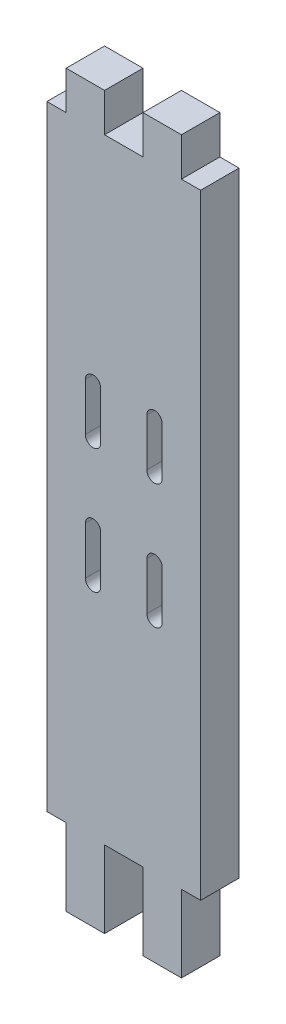
ISO-10303-21;
HEADER;
FILE_DESCRIPTION(('STEP AP214'),'2;1');
FILE_NAME('part.step','',(''),(''),'','','');
FILE_SCHEMA(('AUTOMOTIVE_DESIGN { 1 0 10303 214 1 1 1 1 }'));
ENDSEC;
DATA;
#1=APPLICATION_CONTEXT('core data for automotive mechanical design processes');
#2=APPLICATION_PROTOCOL_DEFINITION('international standard','automotive_design',2000,#1);
#3=PRODUCT_CONTEXT('',#1,'mechanical');
#4=PRODUCT('Part','Part','',(#3));
#5=PRODUCT_RELATED_PRODUCT_CATEGORY('part','',(#4));
#6=PRODUCT_DEFINITION_FORMATION('','',#4);
#7=PRODUCT_DEFINITION_CONTEXT('part definition',#1,'design');
#8=PRODUCT_DEFINITION('design','',#6,#7);
#9=PRODUCT_DEFINITION_SHAPE('','',#8);
#10=(LENGTH_UNIT() NAMED_UNIT(*) SI_UNIT(.MILLI.,.METRE.));
#11=(NAMED_UNIT(*) PLANE_ANGLE_UNIT() SI_UNIT($,.RADIAN.));
#12=(NAMED_UNIT(*) SI_UNIT($,.STERADIAN.) SOLID_ANGLE_UNIT());
#13=UNCERTAINTY_MEASURE_WITH_UNIT(LENGTH_MEASURE(1.E-05),#10,'distance_accuracy_value','');
#14=(GEOMETRIC_REPRESENTATION_CONTEXT(3) GLOBAL_UNCERTAINTY_ASSIGNED_CONTEXT((#13)) GLOBAL_UNIT_ASSIGNED_CONTEXT((#10,
#11,#12)) REPRESENTATION_CONTEXT('',''));
#15=CARTESIAN_POINT('',(0.,0.,0.));
#16=DIRECTION('',(0.,0.,1.));
#17=DIRECTION('',(1.,0.,0.));
#18=AXIS2_PLACEMENT_3D('',#15,#16,#17);
#19=CARTESIAN_POINT('',(0.,0.,5.));
#20=DIRECTION('',(0.,0.,1.));
#21=DIRECTION('',(1.,0.,0.));
#22=AXIS2_PLACEMENT_3D('',#19,#20,#21);
#23=PLANE('',#22);
#24=DIRECTION('',(-1.,0.,0.));
#25=VECTOR('',#24,1.);
#26=CARTESIAN_POINT('',(7.5,40.,5.));
#27=LINE('',#26,#25);
#28=CARTESIAN_POINT('',(10.,40.,5.));
#29=VERTEX_POINT('',#28);
#30=CARTESIAN_POINT('',(7.5,40.,5.));
#31=VERTEX_POINT('',#30);
#32=EDGE_CURVE('E422',#29,#31,#27,.T.);
#33=ORIENTED_EDGE('',*,*,#32,.T.);
#34=DIRECTION('',(0.,1.,0.));
#35=VECTOR('',#34,1.);
#36=CARTESIAN_POINT('',(7.5,45.,5.));
#37=LINE('',#36,#35);
#38=CARTESIAN_POINT('',(7.5,45.,5.));
#39=VERTEX_POINT('',#38);
#40=EDGE_CURVE('E426',#31,#39,#37,.T.);
#41=ORIENTED_EDGE('',*,*,#40,.T.);
#42=DIRECTION('',(-1.,0.,0.));
#43=VECTOR('',#42,1.);
#44=CARTESIAN_POINT('',(2.5,45.,5.));
#45=LINE('',#44,#43);
#46=CARTESIAN_POINT('',(2.5,45.,5.));
#47=VERTEX_POINT('',#46);
#48=EDGE_CURVE('E436',#39,#47,#45,.T.);
#49=ORIENTED_EDGE('',*,*,#48,.T.);
#50=DIRECTION('',(0.,-1.,0.));
#51=VECTOR('',#50,1.);
#52=CARTESIAN_POINT('',(2.5,40.,5.));
#53=LINE('',#52,#51);
#54=CARTESIAN_POINT('',(2.5,40.,5.));
#55=VERTEX_POINT('',#54);
#56=EDGE_CURVE('E438',#47,#55,#53,.T.);
#57=ORIENTED_EDGE('',*,*,#56,.T.);
#58=DIRECTION('',(-1.,0.,0.));
#59=VECTOR('',#58,1.);
#60=CARTESIAN_POINT('',(-2.5,40.,5.));
#61=LINE('',#60,#59);
#62=CARTESIAN_POINT('',(-2.5,40.,5.));
#63=VERTEX_POINT('',#62);
#64=EDGE_CURVE('E441',#55,#63,#61,.T.);
#65=ORIENTED_EDGE('',*,*,#64,.T.);
#66=DIRECTION('',(0.,1.,0.));
#67=VECTOR('',#66,1.);
#68=CARTESIAN_POINT('',(-2.5,45.,5.));
#69=LINE('',#68,#67);
#70=CARTESIAN_POINT('',(-2.5,45.,5.));
#71=VERTEX_POINT('',#70);
#72=EDGE_CURVE('E444',#63,#71,#69,.T.);
#73=ORIENTED_EDGE('',*,*,#72,.T.);
#74=DIRECTION('',(-1.,0.,0.));
#75=VECTOR('',#74,1.);
#76=CARTESIAN_POINT('',(-7.5,45.,5.));
#77=LINE('',#76,#75);
#78=CARTESIAN_POINT('',(-7.5,45.,5.));
#79=VERTEX_POINT('',#78);
#80=EDGE_CURVE('E452',#71,#79,#77,.T.);
#81=ORIENTED_EDGE('',*,*,#80,.T.);
#82=DIRECTION('',(0.,-1.,0.));
#83=VECTOR('',#82,1.);
#84=CARTESIAN_POINT('',(-7.5,40.,5.));
#85=LINE('',#84,#83);
#86=CARTESIAN_POINT('',(-7.5,40.,5.));
#87=VERTEX_POINT('',#86);
#88=EDGE_CURVE('E454',#79,#87,#85,.T.);
#89=ORIENTED_EDGE('',*,*,#88,.T.);
#90=DIRECTION('',(-1.,0.,0.));
#91=VECTOR('',#90,1.);
#92=CARTESIAN_POINT('',(-10.,40.,5.));
#93=LINE('',#92,#91);
#94=CARTESIAN_POINT('',(-10.,40.,5.));
#95=VERTEX_POINT('',#94);
#96=EDGE_CURVE('E457',#87,#95,#93,.T.);
#97=ORIENTED_EDGE('',*,*,#96,.T.);
#98=DIRECTION('',(0.,-1.,0.));
#99=VECTOR('',#98,1.);
#100=CARTESIAN_POINT('',(-10.,-40.,5.));
#101=LINE('',#100,#99);
#102=CARTESIAN_POINT('',(-10.,-40.,5.));
#103=VERTEX_POINT('',#102);
#104=EDGE_CURVE('E460',#95,#103,#101,.T.);
#105=ORIENTED_EDGE('',*,*,#104,.T.);
#106=DIRECTION('',(1.,0.,0.));
#107=VECTOR('',#106,1.);
#108=CARTESIAN_POINT('',(-10.,-40.,5.));
#109=LINE('',#108,#107);
#110=CARTESIAN_POINT('',(-7.5,-40.,5.));
#111=VERTEX_POINT('',#110);
#112=EDGE_CURVE('E468',#103,#111,#109,.T.);
#113=ORIENTED_EDGE('',*,*,#112,.T.);
#114=DIRECTION('',(0.,-1.,0.));
#115=VECTOR('',#114,1.);
#116=CARTESIAN_POINT('',(-7.5,-40.,5.));
#117=LINE('',#116,#115);
#118=CARTESIAN_POINT('',(-7.5,-50.,5.));
#119=VERTEX_POINT('',#118);
#120=EDGE_CURVE('E470',#111,#119,#117,.T.);
#121=ORIENTED_EDGE('',*,*,#120,.T.);
#122=DIRECTION('',(1.,0.,0.));
#123=VECTOR('',#122,1.);
#124=CARTESIAN_POINT('',(-7.5,-50.,5.));
#125=LINE('',#124,#123);
#126=CARTESIAN_POINT('',(-2.5,-50.,5.));
#127=VERTEX_POINT('',#126);
#128=EDGE_CURVE('E473',#119,#127,#125,.T.);
#129=ORIENTED_EDGE('',*,*,#128,.T.);
#130=DIRECTION('',(0.,1.,0.));
#131=VECTOR('',#130,1.);
#132=CARTESIAN_POINT('',(-2.5,-50.,5.));
#133=LINE('',#132,#131);
#134=CARTESIAN_POINT('',(-2.5,-40.,5.));
#135=VERTEX_POINT('',#134);
#136=EDGE_CURVE('E476',#127,#135,#133,.T.);
#137=ORIENTED_EDGE('',*,*,#136,.T.);
#138=DIRECTION('',(1.,0.,0.));
#139=VECTOR('',#138,1.);
#140=CARTESIAN_POINT('',(-2.5,-40.,5.));
#141=LINE('',#140,#139);
#142=CARTESIAN_POINT('',(2.5,-40.,5.));
#143=VERTEX_POINT('',#142);
#144=EDGE_CURVE('E484',#135,#143,#141,.T.);
#145=ORIENTED_EDGE('',*,*,#144,.T.);
#146=DIRECTION('',(0.,-1.,0.));
#147=VECTOR('',#146,1.);
#148=CARTESIAN_POINT('',(2.5,-40.,5.));
#149=LINE('',#148,#147);
#150=CARTESIAN_POINT('',(2.5,-50.,5.));
#151=VERTEX_POINT('',#150);
#152=EDGE_CURVE('E486',#143,#151,#149,.T.);
#153=ORIENTED_EDGE('',*,*,#152,.T.);
#154=DIRECTION('',(1.,0.,0.));
#155=VECTOR('',#154,1.);
#156=CARTESIAN_POINT('',(2.5,-50.,5.));
#157=LINE('',#156,#155);
#158=CARTESIAN_POINT('',(7.5,-50.,5.));
#159=VERTEX_POINT('',#158);
#160=EDGE_CURVE('E489',#151,#159,#157,.T.);
#161=ORIENTED_EDGE('',*,*,#160,.T.);
#162=DIRECTION('',(0.,1.,0.));
#163=VECTOR('',#162,1.);
#164=CARTESIAN_POINT('',(7.5,-50.,5.));
#165=LINE('',#164,#163);
#166=CARTESIAN_POINT('',(7.5,-40.,5.));
#167=VERTEX_POINT('',#166);
#168=EDGE_CURVE('E492',#159,#167,#165,.T.);
#169=ORIENTED_EDGE('',*,*,#168,.T.);
#170=DIRECTION('',(1.,0.,0.));
#171=VECTOR('',#170,1.);
#172=CARTESIAN_POINT('',(7.5,-40.,5.));
#173=LINE('',#172,#171);
#174=CARTESIAN_POINT('',(10.,-40.,5.));
#175=VERTEX_POINT('',#174);
#176=EDGE_CURVE('E498',#167,#175,#173,.T.);
#177=ORIENTED_EDGE('',*,*,#176,.T.);
#178=DIRECTION('',(0.,1.,0.));
#179=VECTOR('',#178,1.);
#180=CARTESIAN_POINT('',(10.,-40.,5.));
#181=LINE('',#180,#179);
#182=EDGE_CURVE('E500',#175,#29,#181,.T.);
#183=ORIENTED_EDGE('',*,*,#182,.T.);
#184=EDGE_LOOP('',(#33,#41,#49,#57,#65,#73,#81,#89,#97,#105,#113,#121,#129,#137,#145,#153,#161,
#169,#177,#183));
#185=FACE_BOUND('',#184,.T.);
#186=DIRECTION('',(0.,1.,0.));
#187=VECTOR('',#186,1.);
#188=CARTESIAN_POINT('',(5.00000000000001,-11.2,5.));
#189=LINE('',#188,#187);
#190=CARTESIAN_POINT('',(5.00000000000001,-11.2,5.));
#191=VERTEX_POINT('',#190);
#192=CARTESIAN_POINT('',(5.,-4.99999999999999,5.));
#193=VERTEX_POINT('',#192);
#194=EDGE_CURVE('E387',#191,#193,#189,.T.);
#195=ORIENTED_EDGE('',*,*,#194,.F.);
#196=CARTESIAN_POINT('',(4.,-11.2,5.));
#197=DIRECTION('',(0.,0.,1.));
#198=DIRECTION('',(1.,0.,0.));
#199=AXIS2_PLACEMENT_3D('',#196,#197,#198);
#200=CIRCLE('',#199,1.);
#201=CARTESIAN_POINT('',(3.,-11.2,5.));
#202=VERTEX_POINT('',#201);
#203=EDGE_CURVE('E384',#202,#191,#200,.T.);
#204=ORIENTED_EDGE('',*,*,#203,.F.);
#205=DIRECTION('',(0.,-1.,0.));
#206=VECTOR('',#205,1.);
#207=CARTESIAN_POINT('',(3.,-11.2,5.));
#208=LINE('',#207,#206);
#209=CARTESIAN_POINT('',(3.,-4.99999999999999,5.));
#210=VERTEX_POINT('',#209);
#211=EDGE_CURVE('E396',#210,#202,#208,.T.);
#212=ORIENTED_EDGE('',*,*,#211,.F.);
#213=CARTESIAN_POINT('',(4.,-4.99999999999999,5.));
#214=DIRECTION('',(0.,0.,1.));
#215=DIRECTION('',(1.,0.,0.));
#216=AXIS2_PLACEMENT_3D('',#213,#214,#215);
#217=CIRCLE('',#216,1.);
#218=EDGE_CURVE('E400',#193,#210,#217,.T.);
#219=ORIENTED_EDGE('',*,*,#218,.F.);
#220=EDGE_LOOP('',(#195,#204,#212,#219));
#221=FACE_BOUND('',#220,.T.);
#222=DIRECTION('',(0.,-1.,0.));
#223=VECTOR('',#222,1.);
#224=CARTESIAN_POINT('',(3.,11.2,5.));
#225=LINE('',#224,#223);
#226=CARTESIAN_POINT('',(3.,11.2,5.));
#227=VERTEX_POINT('',#226);
#228=CARTESIAN_POINT('',(3.,5.00000000000001,5.));
#229=VERTEX_POINT('',#228);
#230=EDGE_CURVE('E349',#227,#229,#225,.T.);
#231=ORIENTED_EDGE('',*,*,#230,.F.);
#232=CARTESIAN_POINT('',(4.,11.2,5.));
#233=DIRECTION('',(0.,0.,1.));
#234=DIRECTION('',(-1.,0.,0.));
#235=AXIS2_PLACEMENT_3D('',#232,#233,#234);
#236=CIRCLE('',#235,1.);
#237=CARTESIAN_POINT('',(5.00000000000001,11.2,5.));
#238=VERTEX_POINT('',#237);
#239=EDGE_CURVE('E346',#238,#227,#236,.T.);
#240=ORIENTED_EDGE('',*,*,#239,.F.);
#241=DIRECTION('',(0.,1.,0.));
#242=VECTOR('',#241,1.);
#243=CARTESIAN_POINT('',(5.00000000000001,11.2,5.));
#244=LINE('',#243,#242);
#245=CARTESIAN_POINT('',(5.,5.00000000000001,5.));
#246=VERTEX_POINT('',#245);
#247=EDGE_CURVE('E358',#246,#238,#244,.T.);
#248=ORIENTED_EDGE('',*,*,#247,.F.);
#249=CARTESIAN_POINT('',(4.,5.00000000000001,5.));
#250=DIRECTION('',(0.,0.,1.));
#251=DIRECTION('',(-1.,0.,0.));
#252=AXIS2_PLACEMENT_3D('',#249,#250,#251);
#253=CIRCLE('',#252,1.);
#254=EDGE_CURVE('E362',#229,#246,#253,.T.);
#255=ORIENTED_EDGE('',*,*,#254,.F.);
#256=EDGE_LOOP('',(#231,#240,#248,#255));
#257=FACE_BOUND('',#256,.T.);
#258=DIRECTION('',(0.,-1.,0.));
#259=VECTOR('',#258,1.);
#260=CARTESIAN_POINT('',(-5.00000000000001,11.2,5.));
#261=LINE('',#260,#259);
#262=CARTESIAN_POINT('',(-5.00000000000001,11.2,5.));
#263=VERTEX_POINT('',#262);
#264=CARTESIAN_POINT('',(-5.,5.,5.));
#265=VERTEX_POINT('',#264);
#266=EDGE_CURVE('E313',#263,#265,#261,.T.);
#267=ORIENTED_EDGE('',*,*,#266,.F.);
#268=CARTESIAN_POINT('',(-4.00000000000001,11.2,5.));
#269=DIRECTION('',(0.,0.,1.));
#270=DIRECTION('',(1.,0.,0.));
#271=AXIS2_PLACEMENT_3D('',#268,#269,#270);
#272=CIRCLE('',#271,1.);
#273=CARTESIAN_POINT('',(-3.00000000000001,11.2,5.));
#274=VERTEX_POINT('',#273);
#275=EDGE_CURVE('E310',#274,#263,#272,.T.);
#276=ORIENTED_EDGE('',*,*,#275,.F.);
#277=DIRECTION('',(0.,1.,0.));
#278=VECTOR('',#277,1.);
#279=CARTESIAN_POINT('',(-3.00000000000001,11.2,5.));
#280=LINE('',#279,#278);
#281=CARTESIAN_POINT('',(-3.,5.,5.));
#282=VERTEX_POINT('',#281);
#283=EDGE_CURVE('E320',#282,#274,#280,.T.);
#284=ORIENTED_EDGE('',*,*,#283,.F.);
#285=CARTESIAN_POINT('',(-4.,5.,5.));
#286=DIRECTION('',(0.,0.,1.));
#287=DIRECTION('',(1.,0.,0.));
#288=AXIS2_PLACEMENT_3D('',#285,#286,#287);
#289=CIRCLE('',#288,1.);
#290=EDGE_CURVE('E324',#265,#282,#289,.T.);
#291=ORIENTED_EDGE('',*,*,#290,.F.);
#292=EDGE_LOOP('',(#267,#276,#284,#291));
#293=FACE_BOUND('',#292,.T.);
#294=DIRECTION('',(0.,1.,0.));
#295=VECTOR('',#294,1.);
#296=CARTESIAN_POINT('',(-3.00000000000001,-11.2,5.));
#297=LINE('',#296,#295);
#298=CARTESIAN_POINT('',(-3.00000000000001,-11.2,5.));
#299=VERTEX_POINT('',#298);
#300=CARTESIAN_POINT('',(-3.,-4.99999999999999,5.));
#301=VERTEX_POINT('',#300);
#302=EDGE_CURVE('E274',#299,#301,#297,.T.);
#303=ORIENTED_EDGE('',*,*,#302,.F.);
#304=CARTESIAN_POINT('',(-4.00000000000001,-11.2,5.));
#305=DIRECTION('',(0.,0.,1.));
#306=DIRECTION('',(-1.,0.,0.));
#307=AXIS2_PLACEMENT_3D('',#304,#305,#306);
#308=CIRCLE('',#307,1.);
#309=CARTESIAN_POINT('',(-5.00000000000001,-11.2,5.));
#310=VERTEX_POINT('',#309);
#311=EDGE_CURVE('E266',#310,#299,#308,.T.);
#312=ORIENTED_EDGE('',*,*,#311,.F.);
#313=DIRECTION('',(0.,-1.,0.));
#314=VECTOR('',#313,1.);
#315=CARTESIAN_POINT('',(-5.00000000000001,-11.2,5.));
#316=LINE('',#315,#314);
#317=CARTESIAN_POINT('',(-5.,-4.99999999999999,5.));
#318=VERTEX_POINT('',#317);
#319=EDGE_CURVE('E288',#318,#310,#316,.T.);
#320=ORIENTED_EDGE('',*,*,#319,.F.);
#321=CARTESIAN_POINT('',(-4.,-4.99999999999999,5.));
#322=DIRECTION('',(0.,0.,1.));
#323=DIRECTION('',(-1.,0.,0.));
#324=AXIS2_PLACEMENT_3D('',#321,#322,#323);
#325=CIRCLE('',#324,1.);
#326=EDGE_CURVE('E286',#301,#318,#325,.T.);
#327=ORIENTED_EDGE('',*,*,#326,.F.);
#328=EDGE_LOOP('',(#303,#312,#320,#327));
#329=FACE_BOUND('',#328,.T.);
#330=ADVANCED_FACE('F33',(#185,#221,#257,#293,#329),#23,.T.);
#331=CARTESIAN_POINT('',(0.,0.,0.));
#332=DIRECTION('',(0.,0.,1.));
#333=DIRECTION('',(1.,0.,0.));
#334=AXIS2_PLACEMENT_3D('',#331,#332,#333);
#335=PLANE('',#334);
#336=CARTESIAN_POINT('',(-4.00000000000001,11.2,0.));
#337=DIRECTION('',(0.,0.,1.));
#338=DIRECTION('',(1.,0.,0.));
#339=AXIS2_PLACEMENT_3D('',#336,#337,#338);
#340=CIRCLE('',#339,1.);
#341=CARTESIAN_POINT('',(-3.00000000000001,11.2,0.));
#342=VERTEX_POINT('',#341);
#343=CARTESIAN_POINT('',(-5.00000000000001,11.2,0.));
#344=VERTEX_POINT('',#343);
#345=EDGE_CURVE('E282',#342,#344,#340,.T.);
#346=ORIENTED_EDGE('',*,*,#345,.T.);
#347=DIRECTION('',(0.,-1.,0.));
#348=VECTOR('',#347,1.);
#349=CARTESIAN_POINT('',(-5.00000000000001,11.2,0.));
#350=LINE('',#349,#348);
#351=CARTESIAN_POINT('',(-5.,5.,0.));
#352=VERTEX_POINT('',#351);
#353=EDGE_CURVE('E328',#344,#352,#350,.T.);
#354=ORIENTED_EDGE('',*,*,#353,.T.);
#355=CARTESIAN_POINT('',(-4.,5.,0.));
#356=DIRECTION('',(0.,0.,1.));
#357=DIRECTION('',(1.,0.,0.));
#358=AXIS2_PLACEMENT_3D('',#355,#356,#357);
#359=CIRCLE('',#358,1.);
#360=CARTESIAN_POINT('',(-3.,5.,0.));
#361=VERTEX_POINT('',#360);
#362=EDGE_CURVE('E331',#352,#361,#359,.T.);
#363=ORIENTED_EDGE('',*,*,#362,.T.);
#364=DIRECTION('',(0.,1.,0.));
#365=VECTOR('',#364,1.);
#366=CARTESIAN_POINT('',(-3.00000000000001,11.2,0.));
#367=LINE('',#366,#365);
#368=EDGE_CURVE('E314',#361,#342,#367,.T.);
#369=ORIENTED_EDGE('',*,*,#368,.T.);
#370=EDGE_LOOP('',(#346,#354,#363,#369));
#371=FACE_BOUND('',#370,.T.);
#372=CARTESIAN_POINT('',(4.,-11.2,0.));
#373=DIRECTION('',(0.,0.,1.));
#374=DIRECTION('',(1.,0.,0.));
#375=AXIS2_PLACEMENT_3D('',#372,#373,#374);
#376=CIRCLE('',#375,1.);
#377=CARTESIAN_POINT('',(3.,-11.2,0.));
#378=VERTEX_POINT('',#377);
#379=CARTESIAN_POINT('',(5.00000000000001,-11.2,0.));
#380=VERTEX_POINT('',#379);
#381=EDGE_CURVE('E383',#378,#380,#376,.T.);
#382=ORIENTED_EDGE('',*,*,#381,.T.);
#383=DIRECTION('',(0.,1.,0.));
#384=VECTOR('',#383,1.);
#385=CARTESIAN_POINT('',(5.00000000000001,-11.2,0.));
#386=LINE('',#385,#384);
#387=CARTESIAN_POINT('',(5.,-4.99999999999999,0.));
#388=VERTEX_POINT('',#387);
#389=EDGE_CURVE('E404',#380,#388,#386,.T.);
#390=ORIENTED_EDGE('',*,*,#389,.T.);
#391=CARTESIAN_POINT('',(4.,-4.99999999999999,0.));
#392=DIRECTION('',(0.,0.,1.));
#393=DIRECTION('',(1.,0.,0.));
#394=AXIS2_PLACEMENT_3D('',#391,#392,#393);
#395=CIRCLE('',#394,1.);
#396=CARTESIAN_POINT('',(3.,-4.99999999999999,0.));
#397=VERTEX_POINT('',#396);
#398=EDGE_CURVE('E407',#388,#397,#395,.T.);
#399=ORIENTED_EDGE('',*,*,#398,.T.);
#400=DIRECTION('',(0.,-1.,0.));
#401=VECTOR('',#400,1.);
#402=CARTESIAN_POINT('',(3.,-11.2,0.));
#403=LINE('',#402,#401);
#404=EDGE_CURVE('E388',#397,#378,#403,.T.);
#405=ORIENTED_EDGE('',*,*,#404,.T.);
#406=EDGE_LOOP('',(#382,#390,#399,#405));
#407=FACE_BOUND('',#406,.T.);
#408=DIRECTION('',(-1.,0.,0.));
#409=VECTOR('',#408,1.);
#410=CARTESIAN_POINT('',(7.5,40.,0.));
#411=LINE('',#410,#409);
#412=CARTESIAN_POINT('',(10.,40.,0.));
#413=VERTEX_POINT('',#412);
#414=CARTESIAN_POINT('',(7.5,40.,0.));
#415=VERTEX_POINT('',#414);
#416=EDGE_CURVE('E421',#413,#415,#411,.T.);
#417=ORIENTED_EDGE('',*,*,#416,.F.);
#418=DIRECTION('',(0.,1.,0.));
#419=VECTOR('',#418,1.);
#420=CARTESIAN_POINT('',(10.,-40.,0.));
#421=LINE('',#420,#419);
#422=CARTESIAN_POINT('',(10.,-40.,0.));
#423=VERTEX_POINT('',#422);
#424=EDGE_CURVE('E427',#423,#413,#421,.T.);
#425=ORIENTED_EDGE('',*,*,#424,.F.);
#426=DIRECTION('',(1.,0.,0.));
#427=VECTOR('',#426,1.);
#428=CARTESIAN_POINT('',(7.5,-40.,0.));
#429=LINE('',#428,#427);
#430=CARTESIAN_POINT('',(7.5,-40.,0.));
#431=VERTEX_POINT('',#430);
#432=EDGE_CURVE('E542',#431,#423,#429,.T.);
#433=ORIENTED_EDGE('',*,*,#432,.F.);
#434=DIRECTION('',(0.,1.,0.));
#435=VECTOR('',#434,1.);
#436=CARTESIAN_POINT('',(7.5,-50.,0.));
#437=LINE('',#436,#435);
#438=CARTESIAN_POINT('',(7.5,-50.,0.));
#439=VERTEX_POINT('',#438);
#440=EDGE_CURVE('E540',#439,#431,#437,.T.);
#441=ORIENTED_EDGE('',*,*,#440,.F.);
#442=DIRECTION('',(1.,0.,0.));
#443=VECTOR('',#442,1.);
#444=CARTESIAN_POINT('',(2.5,-50.,0.));
#445=LINE('',#444,#443);
#446=CARTESIAN_POINT('',(2.5,-50.,0.));
#447=VERTEX_POINT('',#446);
#448=EDGE_CURVE('E538',#447,#439,#445,.T.);
#449=ORIENTED_EDGE('',*,*,#448,.F.);
#450=DIRECTION('',(0.,-1.,0.));
#451=VECTOR('',#450,1.);
#452=CARTESIAN_POINT('',(2.5,-45.,0.));
#453=LINE('',#452,#451);
#454=CARTESIAN_POINT('',(2.5,-40.,0.));
#455=VERTEX_POINT('',#454);
#456=EDGE_CURVE('E536',#455,#447,#453,.T.);
#457=ORIENTED_EDGE('',*,*,#456,.F.);
#458=DIRECTION('',(1.,0.,0.));
#459=VECTOR('',#458,1.);
#460=CARTESIAN_POINT('',(-2.5,-40.,0.));
#461=LINE('',#460,#459);
#462=CARTESIAN_POINT('',(-2.5,-40.,0.));
#463=VERTEX_POINT('',#462);
#464=EDGE_CURVE('E533',#463,#455,#461,.T.);
#465=ORIENTED_EDGE('',*,*,#464,.F.);
#466=DIRECTION('',(0.,1.,0.));
#467=VECTOR('',#466,1.);
#468=CARTESIAN_POINT('',(-2.5,-50.,0.));
#469=LINE('',#468,#467);
#470=CARTESIAN_POINT('',(-2.5,-50.,0.));
#471=VERTEX_POINT('',#470);
#472=EDGE_CURVE('E531',#471,#463,#469,.T.);
#473=ORIENTED_EDGE('',*,*,#472,.F.);
#474=DIRECTION('',(1.,0.,0.));
#475=VECTOR('',#474,1.);
#476=CARTESIAN_POINT('',(-7.5,-50.,0.));
#477=LINE('',#476,#475);
#478=CARTESIAN_POINT('',(-7.5,-50.,0.));
#479=VERTEX_POINT('',#478);
#480=EDGE_CURVE('E529',#479,#471,#477,.T.);
#481=ORIENTED_EDGE('',*,*,#480,.F.);
#482=DIRECTION('',(0.,-1.,0.));
#483=VECTOR('',#482,1.);
#484=CARTESIAN_POINT('',(-7.5,-45.,0.));
#485=LINE('',#484,#483);
#486=CARTESIAN_POINT('',(-7.5,-40.,0.));
#487=VERTEX_POINT('',#486);
#488=EDGE_CURVE('E527',#487,#479,#485,.T.);
#489=ORIENTED_EDGE('',*,*,#488,.F.);
#490=DIRECTION('',(1.,0.,0.));
#491=VECTOR('',#490,1.);
#492=CARTESIAN_POINT('',(-10.,-40.,0.));
#493=LINE('',#492,#491);
#494=CARTESIAN_POINT('',(-10.,-40.,0.));
#495=VERTEX_POINT('',#494);
#496=EDGE_CURVE('E524',#495,#487,#493,.T.);
#497=ORIENTED_EDGE('',*,*,#496,.F.);
#498=DIRECTION('',(0.,-1.,0.));
#499=VECTOR('',#498,1.);
#500=CARTESIAN_POINT('',(-10.,-40.,0.));
#501=LINE('',#500,#499);
#502=CARTESIAN_POINT('',(-10.,40.,0.));
#503=VERTEX_POINT('',#502);
#504=EDGE_CURVE('E522',#503,#495,#501,.T.);
#505=ORIENTED_EDGE('',*,*,#504,.F.);
#506=DIRECTION('',(-1.,0.,0.));
#507=VECTOR('',#506,1.);
#508=CARTESIAN_POINT('',(-10.,40.,0.));
#509=LINE('',#508,#507);
#510=CARTESIAN_POINT('',(-7.5,40.,0.));
#511=VERTEX_POINT('',#510);
#512=EDGE_CURVE('E520',#511,#503,#509,.T.);
#513=ORIENTED_EDGE('',*,*,#512,.F.);
#514=DIRECTION('',(0.,-1.,0.));
#515=VECTOR('',#514,1.);
#516=CARTESIAN_POINT('',(-7.5,40.,0.));
#517=LINE('',#516,#515);
#518=CARTESIAN_POINT('',(-7.5,45.,0.));
#519=VERTEX_POINT('',#518);
#520=EDGE_CURVE('E518',#519,#511,#517,.T.);
#521=ORIENTED_EDGE('',*,*,#520,.F.);
#522=DIRECTION('',(-1.,0.,0.));
#523=VECTOR('',#522,1.);
#524=CARTESIAN_POINT('',(-7.5,45.,0.));
#525=LINE('',#524,#523);
#526=CARTESIAN_POINT('',(-2.5,45.,0.));
#527=VERTEX_POINT('',#526);
#528=EDGE_CURVE('E516',#527,#519,#525,.T.);
#529=ORIENTED_EDGE('',*,*,#528,.F.);
#530=DIRECTION('',(0.,1.,0.));
#531=VECTOR('',#530,1.);
#532=CARTESIAN_POINT('',(-2.5,45.,0.));
#533=LINE('',#532,#531);
#534=CARTESIAN_POINT('',(-2.5,40.,0.));
#535=VERTEX_POINT('',#534);
#536=EDGE_CURVE('E514',#535,#527,#533,.T.);
#537=ORIENTED_EDGE('',*,*,#536,.F.);
#538=DIRECTION('',(-1.,0.,0.));
#539=VECTOR('',#538,1.);
#540=CARTESIAN_POINT('',(-2.5,40.,0.));
#541=LINE('',#540,#539);
#542=CARTESIAN_POINT('',(2.5,40.,0.));
#543=VERTEX_POINT('',#542);
#544=EDGE_CURVE('E512',#543,#535,#541,.T.);
#545=ORIENTED_EDGE('',*,*,#544,.F.);
#546=DIRECTION('',(0.,-1.,0.));
#547=VECTOR('',#546,1.);
#548=CARTESIAN_POINT('',(2.5,40.,0.));
#549=LINE('',#548,#547);
#550=CARTESIAN_POINT('',(2.5,45.,0.));
#551=VERTEX_POINT('',#550);
#552=EDGE_CURVE('E510',#551,#543,#549,.T.);
#553=ORIENTED_EDGE('',*,*,#552,.F.);
#554=DIRECTION('',(-1.,0.,0.));
#555=VECTOR('',#554,1.);
#556=CARTESIAN_POINT('',(2.5,45.,0.));
#557=LINE('',#556,#555);
#558=CARTESIAN_POINT('',(7.5,45.,0.));
#559=VERTEX_POINT('',#558);
#560=EDGE_CURVE('E508',#559,#551,#557,.T.);
#561=ORIENTED_EDGE('',*,*,#560,.F.);
#562=DIRECTION('',(0.,1.,0.));
#563=VECTOR('',#562,1.);
#564=CARTESIAN_POINT('',(7.5,45.,0.));
#565=LINE('',#564,#563);
#566=EDGE_CURVE('E506',#415,#559,#565,.T.);
#567=ORIENTED_EDGE('',*,*,#566,.F.);
#568=EDGE_LOOP('',(#417,#425,#433,#441,#449,#457,#465,#473,#481,#489,#497,#505,#513,#521,#529,
#537,#545,#553,#561,#567));
#569=FACE_BOUND('',#568,.T.);
#570=CARTESIAN_POINT('',(4.,11.2,0.));
#571=DIRECTION('',(0.,0.,1.));
#572=DIRECTION('',(-1.,0.,0.));
#573=AXIS2_PLACEMENT_3D('',#570,#571,#572);
#574=CIRCLE('',#573,1.);
#575=CARTESIAN_POINT('',(5.00000000000001,11.2,0.));
#576=VERTEX_POINT('',#575);
#577=CARTESIAN_POINT('',(3.,11.2,0.));
#578=VERTEX_POINT('',#577);
#579=EDGE_CURVE('E345',#576,#578,#574,.T.);
#580=ORIENTED_EDGE('',*,*,#579,.T.);
#581=DIRECTION('',(0.,-1.,0.));
#582=VECTOR('',#581,1.);
#583=CARTESIAN_POINT('',(3.,11.2,0.));
#584=LINE('',#583,#582);
#585=CARTESIAN_POINT('',(3.,5.00000000000001,0.));
#586=VERTEX_POINT('',#585);
#587=EDGE_CURVE('E366',#578,#586,#584,.T.);
#588=ORIENTED_EDGE('',*,*,#587,.T.);
#589=CARTESIAN_POINT('',(4.,5.00000000000001,0.));
#590=DIRECTION('',(0.,0.,1.));
#591=DIRECTION('',(-1.,0.,0.));
#592=AXIS2_PLACEMENT_3D('',#589,#590,#591);
#593=CIRCLE('',#592,1.);
#594=CARTESIAN_POINT('',(5.,5.00000000000001,0.));
#595=VERTEX_POINT('',#594);
#596=EDGE_CURVE('E369',#586,#595,#593,.T.);
#597=ORIENTED_EDGE('',*,*,#596,.T.);
#598=DIRECTION('',(0.,1.,0.));
#599=VECTOR('',#598,1.);
#600=CARTESIAN_POINT('',(5.00000000000001,11.2,0.));
#601=LINE('',#600,#599);
#602=EDGE_CURVE('E350',#595,#576,#601,.T.);
#603=ORIENTED_EDGE('',*,*,#602,.T.);
#604=EDGE_LOOP('',(#580,#588,#597,#603));
#605=FACE_BOUND('',#604,.T.);
#606=CARTESIAN_POINT('',(-4.00000000000001,-11.2,0.));
#607=DIRECTION('',(0.,0.,1.));
#608=DIRECTION('',(-1.,0.,0.));
#609=AXIS2_PLACEMENT_3D('',#606,#607,#608);
#610=CIRCLE('',#609,1.);
#611=CARTESIAN_POINT('',(-5.00000000000001,-11.2,0.));
#612=VERTEX_POINT('',#611);
#613=CARTESIAN_POINT('',(-3.00000000000001,-11.2,0.));
#614=VERTEX_POINT('',#613);
#615=EDGE_CURVE('E56',#612,#614,#610,.T.);
#616=ORIENTED_EDGE('',*,*,#615,.T.);
#617=DIRECTION('',(0.,1.,0.));
#618=VECTOR('',#617,1.);
#619=CARTESIAN_POINT('',(-3.00000000000001,-11.2,0.));
#620=LINE('',#619,#618);
#621=CARTESIAN_POINT('',(-3.,-4.99999999999999,0.));
#622=VERTEX_POINT('',#621);
#623=EDGE_CURVE('E281',#614,#622,#620,.T.);
#624=ORIENTED_EDGE('',*,*,#623,.T.);
#625=CARTESIAN_POINT('',(-4.,-4.99999999999999,0.));
#626=DIRECTION('',(0.,0.,1.));
#627=DIRECTION('',(-1.,0.,0.));
#628=AXIS2_PLACEMENT_3D('',#625,#626,#627);
#629=CIRCLE('',#628,1.);
#630=CARTESIAN_POINT('',(-5.,-4.99999999999999,0.));
#631=VERTEX_POINT('',#630);
#632=EDGE_CURVE('E302',#622,#631,#629,.T.);
#633=ORIENTED_EDGE('',*,*,#632,.T.);
#634=DIRECTION('',(0.,-1.,0.));
#635=VECTOR('',#634,1.);
#636=CARTESIAN_POINT('',(-5.00000000000001,-11.2,0.));
#637=LINE('',#636,#635);
#638=EDGE_CURVE('E275',#631,#612,#637,.T.);
#639=ORIENTED_EDGE('',*,*,#638,.T.);
#640=EDGE_LOOP('',(#616,#624,#633,#639));
#641=FACE_BOUND('',#640,.T.);
#642=ADVANCED_FACE('F608',(#371,#407,#569,#605,#641),#335,.F.);
#643=CARTESIAN_POINT('',(7.5,40.,5.));
#644=DIRECTION('',(0.,-1.,0.));
#645=DIRECTION('',(0.,0.,-1.));
#646=AXIS2_PLACEMENT_3D('',#643,#644,#645);
#647=PLANE('',#646);
#648=ORIENTED_EDGE('',*,*,#416,.T.);
#649=DIRECTION('',(0.,0.,-1.));
#650=VECTOR('',#649,1.);
#651=CARTESIAN_POINT('',(7.5,40.,5.));
#652=LINE('',#651,#650);
#653=EDGE_CURVE('E12',#31,#415,#652,.T.);
#654=ORIENTED_EDGE('',*,*,#653,.F.);
#655=ORIENTED_EDGE('',*,*,#32,.F.);
#656=DIRECTION('',(0.,0.,-1.));
#657=VECTOR('',#656,1.);
#658=CARTESIAN_POINT('',(10.,40.,5.));
#659=LINE('',#658,#657);
#660=EDGE_CURVE('E503',#29,#413,#659,.T.);
#661=ORIENTED_EDGE('',*,*,#660,.T.);
#662=EDGE_LOOP('',(#648,#654,#655,#661));
#663=FACE_BOUND('',#662,.T.);
#664=ADVANCED_FACE('F35',(#663),#647,.F.);
#665=CARTESIAN_POINT('',(7.5,45.,5.));
#666=DIRECTION('',(-1.,0.,0.));
#667=DIRECTION('',(0.,0.,1.));
#668=AXIS2_PLACEMENT_3D('',#665,#666,#667);
#669=PLANE('',#668);
#670=ORIENTED_EDGE('',*,*,#566,.T.);
#671=DIRECTION('',(0.,0.,-1.));
#672=VECTOR('',#671,1.);
#673=CARTESIAN_POINT('',(7.5,45.,5.));
#674=LINE('',#673,#672);
#675=EDGE_CURVE('E41',#39,#559,#674,.T.);
#676=ORIENTED_EDGE('',*,*,#675,.F.);
#677=ORIENTED_EDGE('',*,*,#40,.F.);
#678=ORIENTED_EDGE('',*,*,#653,.T.);
#679=EDGE_LOOP('',(#670,#676,#677,#678));
#680=FACE_BOUND('',#679,.T.);
#681=ADVANCED_FACE('F626',(#680),#669,.F.);
#682=CARTESIAN_POINT('',(2.5,45.,5.));
#683=DIRECTION('',(0.,-1.,0.));
#684=DIRECTION('',(1.,0.,0.));
#685=AXIS2_PLACEMENT_3D('',#682,#683,#684);
#686=PLANE('',#685);
#687=ORIENTED_EDGE('',*,*,#560,.T.);
#688=DIRECTION('',(0.,0.,-1.));
#689=VECTOR('',#688,1.);
#690=CARTESIAN_POINT('',(2.5,45.,5.));
#691=LINE('',#690,#689);
#692=EDGE_CURVE('E595',#47,#551,#691,.T.);
#693=ORIENTED_EDGE('',*,*,#692,.F.);
#694=ORIENTED_EDGE('',*,*,#48,.F.);
#695=ORIENTED_EDGE('',*,*,#675,.T.);
#696=EDGE_LOOP('',(#687,#693,#694,#695));
#697=FACE_BOUND('',#696,.T.);
#698=ADVANCED_FACE('F602',(#697),#686,.F.);
#699=CARTESIAN_POINT('',(2.5,40.,5.));
#700=DIRECTION('',(1.,0.,0.));
#701=DIRECTION('',(0.,0.,-1.));
#702=AXIS2_PLACEMENT_3D('',#699,#700,#701);
#703=PLANE('',#702);
#704=ORIENTED_EDGE('',*,*,#552,.T.);
#705=DIRECTION('',(0.,0.,-1.));
#706=VECTOR('',#705,1.);
#707=CARTESIAN_POINT('',(2.5,40.,5.));
#708=LINE('',#707,#706);
#709=EDGE_CURVE('E592',#55,#543,#708,.T.);
#710=ORIENTED_EDGE('',*,*,#709,.F.);
#711=ORIENTED_EDGE('',*,*,#56,.F.);
#712=ORIENTED_EDGE('',*,*,#692,.T.);
#713=EDGE_LOOP('',(#704,#710,#711,#712));
#714=FACE_BOUND('',#713,.T.);
#715=ADVANCED_FACE('F614',(#714),#703,.F.);
#716=CARTESIAN_POINT('',(-2.5,40.,5.));
#717=DIRECTION('',(0.,-1.,0.));
#718=DIRECTION('',(0.,0.,-1.));
#719=AXIS2_PLACEMENT_3D('',#716,#717,#718);
#720=PLANE('',#719);
#721=ORIENTED_EDGE('',*,*,#544,.T.);
#722=DIRECTION('',(0.,0.,-1.));
#723=VECTOR('',#722,1.);
#724=CARTESIAN_POINT('',(-2.5,40.,5.));
#725=LINE('',#724,#723);
#726=EDGE_CURVE('E589',#63,#535,#725,.T.);
#727=ORIENTED_EDGE('',*,*,#726,.F.);
#728=ORIENTED_EDGE('',*,*,#64,.F.);
#729=ORIENTED_EDGE('',*,*,#709,.T.);
#730=EDGE_LOOP('',(#721,#727,#728,#729));
#731=FACE_BOUND('',#730,.T.);
#732=ADVANCED_FACE('F618',(#731),#720,.F.);
#733=CARTESIAN_POINT('',(-2.5,45.,5.));
#734=DIRECTION('',(-1.,0.,0.));
#735=DIRECTION('',(0.,0.,1.));
#736=AXIS2_PLACEMENT_3D('',#733,#734,#735);
#737=PLANE('',#736);
#738=ORIENTED_EDGE('',*,*,#536,.T.);
#739=DIRECTION('',(0.,0.,-1.));
#740=VECTOR('',#739,1.);
#741=CARTESIAN_POINT('',(-2.5,45.,5.));
#742=LINE('',#741,#740);
#743=EDGE_CURVE('E586',#71,#527,#742,.T.);
#744=ORIENTED_EDGE('',*,*,#743,.F.);
#745=ORIENTED_EDGE('',*,*,#72,.F.);
#746=ORIENTED_EDGE('',*,*,#726,.T.);
#747=EDGE_LOOP('',(#738,#744,#745,#746));
#748=FACE_BOUND('',#747,.T.);
#749=ADVANCED_FACE('F697',(#748),#737,.F.);
#750=CARTESIAN_POINT('',(-7.5,45.,5.));
#751=DIRECTION('',(0.,-1.,0.));
#752=DIRECTION('',(0.,0.,-1.));
#753=AXIS2_PLACEMENT_3D('',#750,#751,#752);
#754=PLANE('',#753);
#755=ORIENTED_EDGE('',*,*,#528,.T.);
#756=DIRECTION('',(0.,0.,-1.));
#757=VECTOR('',#756,1.);
#758=CARTESIAN_POINT('',(-7.5,45.,5.));
#759=LINE('',#758,#757);
#760=EDGE_CURVE('E583',#79,#519,#759,.T.);
#761=ORIENTED_EDGE('',*,*,#760,.F.);
#762=ORIENTED_EDGE('',*,*,#80,.F.);
#763=ORIENTED_EDGE('',*,*,#743,.T.);
#764=EDGE_LOOP('',(#755,#761,#762,#763));
#765=FACE_BOUND('',#764,.T.);
#766=ADVANCED_FACE('F695',(#765),#754,.F.);
#767=CARTESIAN_POINT('',(-7.5,40.,5.));
#768=DIRECTION('',(1.,0.,0.));
#769=DIRECTION('',(0.,0.,-1.));
#770=AXIS2_PLACEMENT_3D('',#767,#768,#769);
#771=PLANE('',#770);
#772=ORIENTED_EDGE('',*,*,#520,.T.);
#773=DIRECTION('',(0.,0.,-1.));
#774=VECTOR('',#773,1.);
#775=CARTESIAN_POINT('',(-7.5,40.,5.));
#776=LINE('',#775,#774);
#777=EDGE_CURVE('E580',#87,#511,#776,.T.);
#778=ORIENTED_EDGE('',*,*,#777,.F.);
#779=ORIENTED_EDGE('',*,*,#88,.F.);
#780=ORIENTED_EDGE('',*,*,#760,.T.);
#781=EDGE_LOOP('',(#772,#778,#779,#780));
#782=FACE_BOUND('',#781,.T.);
#783=ADVANCED_FACE('F691',(#782),#771,.F.);
#784=CARTESIAN_POINT('',(-10.,40.,5.));
#785=DIRECTION('',(0.,-1.,0.));
#786=DIRECTION('',(0.,0.,-1.));
#787=AXIS2_PLACEMENT_3D('',#784,#785,#786);
#788=PLANE('',#787);
#789=ORIENTED_EDGE('',*,*,#512,.T.);
#790=DIRECTION('',(0.,0.,-1.));
#791=VECTOR('',#790,1.);
#792=CARTESIAN_POINT('',(-10.,40.,5.));
#793=LINE('',#792,#791);
#794=EDGE_CURVE('E577',#95,#503,#793,.T.);
#795=ORIENTED_EDGE('',*,*,#794,.F.);
#796=ORIENTED_EDGE('',*,*,#96,.F.);
#797=ORIENTED_EDGE('',*,*,#777,.T.);
#798=EDGE_LOOP('',(#789,#795,#796,#797));
#799=FACE_BOUND('',#798,.T.);
#800=ADVANCED_FACE('F686',(#799),#788,.F.);
#801=CARTESIAN_POINT('',(-10.,-40.,5.));
#802=DIRECTION('',(1.,0.,0.));
#803=DIRECTION('',(0.,0.,-1.));
#804=AXIS2_PLACEMENT_3D('',#801,#802,#803);
#805=PLANE('',#804);
#806=ORIENTED_EDGE('',*,*,#504,.T.);
#807=DIRECTION('',(0.,0.,-1.));
#808=VECTOR('',#807,1.);
#809=CARTESIAN_POINT('',(-10.,-40.,5.));
#810=LINE('',#809,#808);
#811=EDGE_CURVE('E574',#103,#495,#810,.T.);
#812=ORIENTED_EDGE('',*,*,#811,.F.);
#813=ORIENTED_EDGE('',*,*,#104,.F.);
#814=ORIENTED_EDGE('',*,*,#794,.T.);
#815=EDGE_LOOP('',(#806,#812,#813,#814));
#816=FACE_BOUND('',#815,.T.);
#817=ADVANCED_FACE('F680',(#816),#805,.F.);
#818=CARTESIAN_POINT('',(-10.,-40.,5.));
#819=DIRECTION('',(0.,1.,0.));
#820=DIRECTION('',(0.,0.,1.));
#821=AXIS2_PLACEMENT_3D('',#818,#819,#820);
#822=PLANE('',#821);
#823=ORIENTED_EDGE('',*,*,#496,.T.);
#824=DIRECTION('',(0.,0.,-1.));
#825=VECTOR('',#824,1.);
#826=CARTESIAN_POINT('',(-7.5,-40.,5.));
#827=LINE('',#826,#825);
#828=EDGE_CURVE('E571',#111,#487,#827,.T.);
#829=ORIENTED_EDGE('',*,*,#828,.F.);
#830=ORIENTED_EDGE('',*,*,#112,.F.);
#831=ORIENTED_EDGE('',*,*,#811,.T.);
#832=EDGE_LOOP('',(#823,#829,#830,#831));
#833=FACE_BOUND('',#832,.T.);
#834=ADVANCED_FACE('F675',(#833),#822,.F.);
#835=CARTESIAN_POINT('',(-7.5,-45.,5.));
#836=DIRECTION('',(1.,0.,0.));
#837=DIRECTION('',(0.,0.,-1.));
#838=AXIS2_PLACEMENT_3D('',#835,#836,#837);
#839=PLANE('',#838);
#840=ORIENTED_EDGE('',*,*,#488,.T.);
#841=DIRECTION('',(0.,0.,-1.));
#842=VECTOR('',#841,1.);
#843=CARTESIAN_POINT('',(-7.5,-50.,5.));
#844=LINE('',#843,#842);
#845=EDGE_CURVE('E568',#119,#479,#844,.T.);
#846=ORIENTED_EDGE('',*,*,#845,.F.);
#847=ORIENTED_EDGE('',*,*,#120,.F.);
#848=ORIENTED_EDGE('',*,*,#828,.T.);
#849=EDGE_LOOP('',(#840,#846,#847,#848));
#850=FACE_BOUND('',#849,.T.);
#851=ADVANCED_FACE('F670',(#850),#839,.F.);
#852=CARTESIAN_POINT('',(-7.5,-50.,5.));
#853=DIRECTION('',(0.,1.,0.));
#854=DIRECTION('',(0.,0.,1.));
#855=AXIS2_PLACEMENT_3D('',#852,#853,#854);
#856=PLANE('',#855);
#857=ORIENTED_EDGE('',*,*,#480,.T.);
#858=DIRECTION('',(0.,0.,-1.));
#859=VECTOR('',#858,1.);
#860=CARTESIAN_POINT('',(-2.5,-50.,5.));
#861=LINE('',#860,#859);
#862=EDGE_CURVE('E565',#127,#471,#861,.T.);
#863=ORIENTED_EDGE('',*,*,#862,.F.);
#864=ORIENTED_EDGE('',*,*,#128,.F.);
#865=ORIENTED_EDGE('',*,*,#845,.T.);
#866=EDGE_LOOP('',(#857,#863,#864,#865));
#867=FACE_BOUND('',#866,.T.);
#868=ADVANCED_FACE('F666',(#867),#856,.F.);
#869=CARTESIAN_POINT('',(-2.5,-50.,5.));
#870=DIRECTION('',(-1.,0.,0.));
#871=DIRECTION('',(0.,-1.,0.));
#872=AXIS2_PLACEMENT_3D('',#869,#870,#871);
#873=PLANE('',#872);
#874=ORIENTED_EDGE('',*,*,#472,.T.);
#875=DIRECTION('',(0.,0.,-1.));
#876=VECTOR('',#875,1.);
#877=CARTESIAN_POINT('',(-2.5,-40.,5.));
#878=LINE('',#877,#876);
#879=EDGE_CURVE('E562',#135,#463,#878,.T.);
#880=ORIENTED_EDGE('',*,*,#879,.F.);
#881=ORIENTED_EDGE('',*,*,#136,.F.);
#882=ORIENTED_EDGE('',*,*,#862,.T.);
#883=EDGE_LOOP('',(#874,#880,#881,#882));
#884=FACE_BOUND('',#883,.T.);
#885=ADVANCED_FACE('F661',(#884),#873,.F.);
#886=CARTESIAN_POINT('',(-2.5,-40.,5.));
#887=DIRECTION('',(0.,1.,0.));
#888=DIRECTION('',(0.,0.,1.));
#889=AXIS2_PLACEMENT_3D('',#886,#887,#888);
#890=PLANE('',#889);
#891=ORIENTED_EDGE('',*,*,#464,.T.);
#892=DIRECTION('',(0.,0.,-1.));
#893=VECTOR('',#892,1.);
#894=CARTESIAN_POINT('',(2.5,-40.,5.));
#895=LINE('',#894,#893);
#896=EDGE_CURVE('E559',#143,#455,#895,.T.);
#897=ORIENTED_EDGE('',*,*,#896,.F.);
#898=ORIENTED_EDGE('',*,*,#144,.F.);
#899=ORIENTED_EDGE('',*,*,#879,.T.);
#900=EDGE_LOOP('',(#891,#897,#898,#899));
#901=FACE_BOUND('',#900,.T.);
#902=ADVANCED_FACE('F656',(#901),#890,.F.);
#903=CARTESIAN_POINT('',(2.5,-45.,5.));
#904=DIRECTION('',(1.,0.,0.));
#905=DIRECTION('',(0.,1.,0.));
#906=AXIS2_PLACEMENT_3D('',#903,#904,#905);
#907=PLANE('',#906);
#908=ORIENTED_EDGE('',*,*,#456,.T.);
#909=DIRECTION('',(0.,0.,-1.));
#910=VECTOR('',#909,1.);
#911=CARTESIAN_POINT('',(2.5,-50.,5.));
#912=LINE('',#911,#910);
#913=EDGE_CURVE('E556',#151,#447,#912,.T.);
#914=ORIENTED_EDGE('',*,*,#913,.F.);
#915=ORIENTED_EDGE('',*,*,#152,.F.);
#916=ORIENTED_EDGE('',*,*,#896,.T.);
#917=EDGE_LOOP('',(#908,#914,#915,#916));
#918=FACE_BOUND('',#917,.T.);
#919=ADVANCED_FACE('F652',(#918),#907,.F.);
#920=CARTESIAN_POINT('',(2.5,-50.,5.));
#921=DIRECTION('',(0.,1.,0.));
#922=DIRECTION('',(0.,0.,1.));
#923=AXIS2_PLACEMENT_3D('',#920,#921,#922);
#924=PLANE('',#923);
#925=ORIENTED_EDGE('',*,*,#448,.T.);
#926=DIRECTION('',(0.,0.,-1.));
#927=VECTOR('',#926,1.);
#928=CARTESIAN_POINT('',(7.5,-50.,5.));
#929=LINE('',#928,#927);
#930=EDGE_CURVE('E553',#159,#439,#929,.T.);
#931=ORIENTED_EDGE('',*,*,#930,.F.);
#932=ORIENTED_EDGE('',*,*,#160,.F.);
#933=ORIENTED_EDGE('',*,*,#913,.T.);
#934=EDGE_LOOP('',(#925,#931,#932,#933));
#935=FACE_BOUND('',#934,.T.);
#936=ADVANCED_FACE('F647',(#935),#924,.F.);
#937=CARTESIAN_POINT('',(7.5,-50.,5.));
#938=DIRECTION('',(-1.,0.,0.));
#939=DIRECTION('',(0.,0.,1.));
#940=AXIS2_PLACEMENT_3D('',#937,#938,#939);
#941=PLANE('',#940);
#942=ORIENTED_EDGE('',*,*,#440,.T.);
#943=DIRECTION('',(0.,0.,-1.));
#944=VECTOR('',#943,1.);
#945=CARTESIAN_POINT('',(7.5,-40.,5.));
#946=LINE('',#945,#944);
#947=EDGE_CURVE('E550',#167,#431,#946,.T.);
#948=ORIENTED_EDGE('',*,*,#947,.F.);
#949=ORIENTED_EDGE('',*,*,#168,.F.);
#950=ORIENTED_EDGE('',*,*,#930,.T.);
#951=EDGE_LOOP('',(#942,#948,#949,#950));
#952=FACE_BOUND('',#951,.T.);
#953=ADVANCED_FACE('F642',(#952),#941,.F.);
#954=CARTESIAN_POINT('',(7.5,-40.,5.));
#955=DIRECTION('',(0.,1.,0.));
#956=DIRECTION('',(0.,0.,1.));
#957=AXIS2_PLACEMENT_3D('',#954,#955,#956);
#958=PLANE('',#957);
#959=ORIENTED_EDGE('',*,*,#432,.T.);
#960=DIRECTION('',(0.,0.,-1.));
#961=VECTOR('',#960,1.);
#962=CARTESIAN_POINT('',(10.,-40.,5.));
#963=LINE('',#962,#961);
#964=EDGE_CURVE('E547',#175,#423,#963,.T.);
#965=ORIENTED_EDGE('',*,*,#964,.F.);
#966=ORIENTED_EDGE('',*,*,#176,.F.);
#967=ORIENTED_EDGE('',*,*,#947,.T.);
#968=EDGE_LOOP('',(#959,#965,#966,#967));
#969=FACE_BOUND('',#968,.T.);
#970=ADVANCED_FACE('F638',(#969),#958,.F.);
#971=CARTESIAN_POINT('',(10.,-40.,5.));
#972=DIRECTION('',(-1.,0.,0.));
#973=DIRECTION('',(0.,0.,1.));
#974=AXIS2_PLACEMENT_3D('',#971,#972,#973);
#975=PLANE('',#974);
#976=ORIENTED_EDGE('',*,*,#424,.T.);
#977=ORIENTED_EDGE('',*,*,#660,.F.);
#978=ORIENTED_EDGE('',*,*,#182,.F.);
#979=ORIENTED_EDGE('',*,*,#964,.T.);
#980=EDGE_LOOP('',(#976,#977,#978,#979));
#981=FACE_BOUND('',#980,.T.);
#982=ADVANCED_FACE('F633',(#981),#975,.F.);
#983=CARTESIAN_POINT('',(4.,-11.2,5.));
#984=DIRECTION('',(0.,0.,-1.));
#985=DIRECTION('',(-1.,0.,0.));
#986=AXIS2_PLACEMENT_3D('',#983,#984,#985);
#987=CYLINDRICAL_SURFACE('',#986,1.);
#988=ORIENTED_EDGE('',*,*,#381,.F.);
#989=DIRECTION('',(0.,0.,-1.));
#990=VECTOR('',#989,1.);
#991=CARTESIAN_POINT('',(3.,-11.2,5.));
#992=LINE('',#991,#990);
#993=EDGE_CURVE('E399',#202,#378,#992,.T.);
#994=ORIENTED_EDGE('',*,*,#993,.F.);
#995=ORIENTED_EDGE('',*,*,#203,.T.);
#996=DIRECTION('',(0.,0.,-1.));
#997=VECTOR('',#996,1.);
#998=CARTESIAN_POINT('',(5.00000000000001,-11.2,5.));
#999=LINE('',#998,#997);
#1000=EDGE_CURVE('E418',#191,#380,#999,.T.);
#1001=ORIENTED_EDGE('',*,*,#1000,.T.);
#1002=EDGE_LOOP('',(#988,#994,#995,#1001));
#1003=FACE_BOUND('',#1002,.T.);
#1004=ADVANCED_FACE('F714',(#1003),#987,.F.);
#1005=CARTESIAN_POINT('',(5.00000000000001,-11.2,5.));
#1006=DIRECTION('',(-1.,0.,0.));
#1007=DIRECTION('',(0.,-1.,0.));
#1008=AXIS2_PLACEMENT_3D('',#1005,#1006,#1007);
#1009=PLANE('',#1008);
#1010=ORIENTED_EDGE('',*,*,#389,.F.);
#1011=ORIENTED_EDGE('',*,*,#1000,.F.);
#1012=ORIENTED_EDGE('',*,*,#194,.T.);
#1013=DIRECTION('',(0.,0.,-1.));
#1014=VECTOR('',#1013,1.);
#1015=CARTESIAN_POINT('',(5.,-4.99999999999999,5.));
#1016=LINE('',#1015,#1014);
#1017=EDGE_CURVE('E416',#193,#388,#1016,.T.);
#1018=ORIENTED_EDGE('',*,*,#1017,.T.);
#1019=EDGE_LOOP('',(#1010,#1011,#1012,#1018));
#1020=FACE_BOUND('',#1019,.T.);
#1021=ADVANCED_FACE('F800',(#1020),#1009,.T.);
#1022=CARTESIAN_POINT('',(4.,-4.99999999999999,5.));
#1023=DIRECTION('',(0.,0.,-1.));
#1024=DIRECTION('',(-1.,0.,0.));
#1025=AXIS2_PLACEMENT_3D('',#1022,#1023,#1024);
#1026=CYLINDRICAL_SURFACE('',#1025,1.);
#1027=ORIENTED_EDGE('',*,*,#398,.F.);
#1028=ORIENTED_EDGE('',*,*,#1017,.F.);
#1029=ORIENTED_EDGE('',*,*,#218,.T.);
#1030=DIRECTION('',(0.,0.,-1.));
#1031=VECTOR('',#1030,1.);
#1032=CARTESIAN_POINT('',(3.,-4.99999999999999,5.));
#1033=LINE('',#1032,#1031);
#1034=EDGE_CURVE('E414',#210,#397,#1033,.T.);
#1035=ORIENTED_EDGE('',*,*,#1034,.T.);
#1036=EDGE_LOOP('',(#1027,#1028,#1029,#1035));
#1037=FACE_BOUND('',#1036,.T.);
#1038=ADVANCED_FACE('F807',(#1037),#1026,.F.);
#1039=CARTESIAN_POINT('',(3.,-11.2,5.));
#1040=DIRECTION('',(1.,0.,0.));
#1041=DIRECTION('',(0.,1.,0.));
#1042=AXIS2_PLACEMENT_3D('',#1039,#1040,#1041);
#1043=PLANE('',#1042);
#1044=ORIENTED_EDGE('',*,*,#404,.F.);
#1045=ORIENTED_EDGE('',*,*,#1034,.F.);
#1046=ORIENTED_EDGE('',*,*,#211,.T.);
#1047=ORIENTED_EDGE('',*,*,#993,.T.);
#1048=EDGE_LOOP('',(#1044,#1045,#1046,#1047));
#1049=FACE_BOUND('',#1048,.T.);
#1050=ADVANCED_FACE('F814',(#1049),#1043,.T.);
#1051=CARTESIAN_POINT('',(4.,11.2,5.));
#1052=DIRECTION('',(0.,0.,-1.));
#1053=DIRECTION('',(-1.,0.,0.));
#1054=AXIS2_PLACEMENT_3D('',#1051,#1052,#1053);
#1055=CYLINDRICAL_SURFACE('',#1054,1.);
#1056=ORIENTED_EDGE('',*,*,#579,.F.);
#1057=DIRECTION('',(0.,0.,-1.));
#1058=VECTOR('',#1057,1.);
#1059=CARTESIAN_POINT('',(5.00000000000001,11.2,5.));
#1060=LINE('',#1059,#1058);
#1061=EDGE_CURVE('E361',#238,#576,#1060,.T.);
#1062=ORIENTED_EDGE('',*,*,#1061,.F.);
#1063=ORIENTED_EDGE('',*,*,#239,.T.);
#1064=DIRECTION('',(0.,0.,-1.));
#1065=VECTOR('',#1064,1.);
#1066=CARTESIAN_POINT('',(3.,11.2,5.));
#1067=LINE('',#1066,#1065);
#1068=EDGE_CURVE('E380',#227,#578,#1067,.T.);
#1069=ORIENTED_EDGE('',*,*,#1068,.T.);
#1070=EDGE_LOOP('',(#1056,#1062,#1063,#1069));
#1071=FACE_BOUND('',#1070,.T.);
#1072=ADVANCED_FACE('F822',(#1071),#1055,.F.);
#1073=CARTESIAN_POINT('',(3.,11.2,5.));
#1074=DIRECTION('',(1.,0.,0.));
#1075=DIRECTION('',(0.,1.,0.));
#1076=AXIS2_PLACEMENT_3D('',#1073,#1074,#1075);
#1077=PLANE('',#1076);
#1078=ORIENTED_EDGE('',*,*,#587,.F.);
#1079=ORIENTED_EDGE('',*,*,#1068,.F.);
#1080=ORIENTED_EDGE('',*,*,#230,.T.);
#1081=DIRECTION('',(0.,0.,-1.));
#1082=VECTOR('',#1081,1.);
#1083=CARTESIAN_POINT('',(3.,5.00000000000001,5.));
#1084=LINE('',#1083,#1082);
#1085=EDGE_CURVE('E378',#229,#586,#1084,.T.);
#1086=ORIENTED_EDGE('',*,*,#1085,.T.);
#1087=EDGE_LOOP('',(#1078,#1079,#1080,#1086));
#1088=FACE_BOUND('',#1087,.T.);
#1089=ADVANCED_FACE('F830',(#1088),#1077,.T.);
#1090=CARTESIAN_POINT('',(4.,5.00000000000001,5.));
#1091=DIRECTION('',(0.,0.,-1.));
#1092=DIRECTION('',(-1.,0.,0.));
#1093=AXIS2_PLACEMENT_3D('',#1090,#1091,#1092);
#1094=CYLINDRICAL_SURFACE('',#1093,1.);
#1095=ORIENTED_EDGE('',*,*,#596,.F.);
#1096=ORIENTED_EDGE('',*,*,#1085,.F.);
#1097=ORIENTED_EDGE('',*,*,#254,.T.);
#1098=DIRECTION('',(0.,0.,-1.));
#1099=VECTOR('',#1098,1.);
#1100=CARTESIAN_POINT('',(5.,5.00000000000001,5.));
#1101=LINE('',#1100,#1099);
#1102=EDGE_CURVE('E376',#246,#595,#1101,.T.);
#1103=ORIENTED_EDGE('',*,*,#1102,.T.);
#1104=EDGE_LOOP('',(#1095,#1096,#1097,#1103));
#1105=FACE_BOUND('',#1104,.T.);
#1106=ADVANCED_FACE('F838',(#1105),#1094,.F.);
#1107=CARTESIAN_POINT('',(5.00000000000001,11.2,5.));
#1108=DIRECTION('',(-1.,0.,0.));
#1109=DIRECTION('',(0.,-1.,0.));
#1110=AXIS2_PLACEMENT_3D('',#1107,#1108,#1109);
#1111=PLANE('',#1110);
#1112=ORIENTED_EDGE('',*,*,#602,.F.);
#1113=ORIENTED_EDGE('',*,*,#1102,.F.);
#1114=ORIENTED_EDGE('',*,*,#247,.T.);
#1115=ORIENTED_EDGE('',*,*,#1061,.T.);
#1116=EDGE_LOOP('',(#1112,#1113,#1114,#1115));
#1117=FACE_BOUND('',#1116,.T.);
#1118=ADVANCED_FACE('F846',(#1117),#1111,.T.);
#1119=CARTESIAN_POINT('',(-4.00000000000001,11.2,5.));
#1120=DIRECTION('',(0.,0.,-1.));
#1121=DIRECTION('',(-1.,0.,0.));
#1122=AXIS2_PLACEMENT_3D('',#1119,#1120,#1121);
#1123=CYLINDRICAL_SURFACE('',#1122,1.);
#1124=ORIENTED_EDGE('',*,*,#345,.F.);
#1125=DIRECTION('',(0.,0.,-1.));
#1126=VECTOR('',#1125,1.);
#1127=CARTESIAN_POINT('',(-3.00000000000001,11.2,5.));
#1128=LINE('',#1127,#1126);
#1129=EDGE_CURVE('E323',#274,#342,#1128,.T.);
#1130=ORIENTED_EDGE('',*,*,#1129,.F.);
#1131=ORIENTED_EDGE('',*,*,#275,.T.);
#1132=DIRECTION('',(0.,0.,-1.));
#1133=VECTOR('',#1132,1.);
#1134=CARTESIAN_POINT('',(-5.00000000000001,11.2,5.));
#1135=LINE('',#1134,#1133);
#1136=EDGE_CURVE('E342',#263,#344,#1135,.T.);
#1137=ORIENTED_EDGE('',*,*,#1136,.T.);
#1138=EDGE_LOOP('',(#1124,#1130,#1131,#1137));
#1139=FACE_BOUND('',#1138,.T.);
#1140=ADVANCED_FACE('F854',(#1139),#1123,.F.);
#1141=CARTESIAN_POINT('',(-5.00000000000001,11.2,5.));
#1142=DIRECTION('',(1.,0.,0.));
#1143=DIRECTION('',(0.,1.,0.));
#1144=AXIS2_PLACEMENT_3D('',#1141,#1142,#1143);
#1145=PLANE('',#1144);
#1146=ORIENTED_EDGE('',*,*,#353,.F.);
#1147=ORIENTED_EDGE('',*,*,#1136,.F.);
#1148=ORIENTED_EDGE('',*,*,#266,.T.);
#1149=DIRECTION('',(0.,0.,-1.));
#1150=VECTOR('',#1149,1.);
#1151=CARTESIAN_POINT('',(-5.,5.,5.));
#1152=LINE('',#1151,#1150);
#1153=EDGE_CURVE('E340',#265,#352,#1152,.T.);
#1154=ORIENTED_EDGE('',*,*,#1153,.T.);
#1155=EDGE_LOOP('',(#1146,#1147,#1148,#1154));
#1156=FACE_BOUND('',#1155,.T.);
#1157=ADVANCED_FACE('F862',(#1156),#1145,.T.);
#1158=CARTESIAN_POINT('',(-4.,5.,5.));
#1159=DIRECTION('',(0.,0.,-1.));
#1160=DIRECTION('',(-1.,0.,0.));
#1161=AXIS2_PLACEMENT_3D('',#1158,#1159,#1160);
#1162=CYLINDRICAL_SURFACE('',#1161,1.);
#1163=ORIENTED_EDGE('',*,*,#362,.F.);
#1164=ORIENTED_EDGE('',*,*,#1153,.F.);
#1165=ORIENTED_EDGE('',*,*,#290,.T.);
#1166=DIRECTION('',(0.,0.,-1.));
#1167=VECTOR('',#1166,1.);
#1168=CARTESIAN_POINT('',(-3.,5.,5.));
#1169=LINE('',#1168,#1167);
#1170=EDGE_CURVE('E338',#282,#361,#1169,.T.);
#1171=ORIENTED_EDGE('',*,*,#1170,.T.);
#1172=EDGE_LOOP('',(#1163,#1164,#1165,#1171));
#1173=FACE_BOUND('',#1172,.T.);
#1174=ADVANCED_FACE('F870',(#1173),#1162,.F.);
#1175=CARTESIAN_POINT('',(-3.00000000000001,11.2,5.));
#1176=DIRECTION('',(-1.,0.,0.));
#1177=DIRECTION('',(0.,-1.,0.));
#1178=AXIS2_PLACEMENT_3D('',#1175,#1176,#1177);
#1179=PLANE('',#1178);
#1180=ORIENTED_EDGE('',*,*,#368,.F.);
#1181=ORIENTED_EDGE('',*,*,#1170,.F.);
#1182=ORIENTED_EDGE('',*,*,#283,.T.);
#1183=ORIENTED_EDGE('',*,*,#1129,.T.);
#1184=EDGE_LOOP('',(#1180,#1181,#1182,#1183));
#1185=FACE_BOUND('',#1184,.T.);
#1186=ADVANCED_FACE('F878',(#1185),#1179,.T.);
#1187=CARTESIAN_POINT('',(-4.00000000000001,-11.2,5.));
#1188=DIRECTION('',(0.,0.,-1.));
#1189=DIRECTION('',(-1.,0.,0.));
#1190=AXIS2_PLACEMENT_3D('',#1187,#1188,#1189);
#1191=CYLINDRICAL_SURFACE('',#1190,1.);
#1192=ORIENTED_EDGE('',*,*,#615,.F.);
#1193=DIRECTION('',(0.,0.,-1.));
#1194=VECTOR('',#1193,1.);
#1195=CARTESIAN_POINT('',(-5.00000000000001,-11.2,5.));
#1196=LINE('',#1195,#1194);
#1197=EDGE_CURVE('E270',#310,#612,#1196,.T.);
#1198=ORIENTED_EDGE('',*,*,#1197,.F.);
#1199=ORIENTED_EDGE('',*,*,#311,.T.);
#1200=DIRECTION('',(0.,0.,-1.));
#1201=VECTOR('',#1200,1.);
#1202=CARTESIAN_POINT('',(-3.00000000000001,-11.2,5.));
#1203=LINE('',#1202,#1201);
#1204=EDGE_CURVE('E269',#299,#614,#1203,.T.);
#1205=ORIENTED_EDGE('',*,*,#1204,.T.);
#1206=EDGE_LOOP('',(#1192,#1198,#1199,#1205));
#1207=FACE_BOUND('',#1206,.T.);
#1208=ADVANCED_FACE('F268',(#1207),#1191,.F.);
#1209=CARTESIAN_POINT('',(-3.00000000000001,-11.2,5.));
#1210=DIRECTION('',(-1.,0.,0.));
#1211=DIRECTION('',(0.,-1.,0.));
#1212=AXIS2_PLACEMENT_3D('',#1209,#1210,#1211);
#1213=PLANE('',#1212);
#1214=ORIENTED_EDGE('',*,*,#623,.F.);
#1215=ORIENTED_EDGE('',*,*,#1204,.F.);
#1216=ORIENTED_EDGE('',*,*,#302,.T.);
#1217=DIRECTION('',(0.,0.,-1.));
#1218=VECTOR('',#1217,1.);
#1219=CARTESIAN_POINT('',(-3.,-4.99999999999999,5.));
#1220=LINE('',#1219,#1218);
#1221=EDGE_CURVE('E283',#301,#622,#1220,.T.);
#1222=ORIENTED_EDGE('',*,*,#1221,.T.);
#1223=EDGE_LOOP('',(#1214,#1215,#1216,#1222));
#1224=FACE_BOUND('',#1223,.T.);
#1225=ADVANCED_FACE('F278',(#1224),#1213,.T.);
#1226=CARTESIAN_POINT('',(-4.,-4.99999999999999,5.));
#1227=DIRECTION('',(0.,0.,-1.));
#1228=DIRECTION('',(-1.,0.,0.));
#1229=AXIS2_PLACEMENT_3D('',#1226,#1227,#1228);
#1230=CYLINDRICAL_SURFACE('',#1229,1.);
#1231=ORIENTED_EDGE('',*,*,#632,.F.);
#1232=ORIENTED_EDGE('',*,*,#1221,.F.);
#1233=ORIENTED_EDGE('',*,*,#326,.T.);
#1234=DIRECTION('',(0.,0.,-1.));
#1235=VECTOR('',#1234,1.);
#1236=CARTESIAN_POINT('',(-5.,-4.99999999999999,5.));
#1237=LINE('',#1236,#1235);
#1238=EDGE_CURVE('E48',#318,#631,#1237,.T.);
#1239=ORIENTED_EDGE('',*,*,#1238,.T.);
#1240=EDGE_LOOP('',(#1231,#1232,#1233,#1239));
#1241=FACE_BOUND('',#1240,.T.);
#1242=ADVANCED_FACE('F899',(#1241),#1230,.F.);
#1243=CARTESIAN_POINT('',(-5.00000000000001,-11.2,5.));
#1244=DIRECTION('',(1.,0.,0.));
#1245=DIRECTION('',(0.,1.,0.));
#1246=AXIS2_PLACEMENT_3D('',#1243,#1244,#1245);
#1247=PLANE('',#1246);
#1248=ORIENTED_EDGE('',*,*,#638,.F.);
#1249=ORIENTED_EDGE('',*,*,#1238,.F.);
#1250=ORIENTED_EDGE('',*,*,#319,.T.);
#1251=ORIENTED_EDGE('',*,*,#1197,.T.);
#1252=EDGE_LOOP('',(#1248,#1249,#1250,#1251));
#1253=FACE_BOUND('',#1252,.T.);
#1254=ADVANCED_FACE('F906',(#1253),#1247,.T.);
#1255=CLOSED_SHELL('',(#330,#642,#664,#681,#698,#715,#732,#749,#766,#783,#800,#817,#834,#851,
#868,#885,#902,#919,#936,#953,#970,#982,#1004,#1021,#1038,#1050,#1072,#1089,#1106,#1118,#1140,
#1157,#1174,#1186,#1208,#1225,#1242,#1254));
#1256=MANIFOLD_SOLID_BREP('B2',#1255);
#1257=ADVANCED_BREP_SHAPE_REPRESENTATION('',(#18,#1256),#14);
#1258=SHAPE_DEFINITION_REPRESENTATION(#9,#1257);
ENDSEC;
END-ISO-10303-21;
